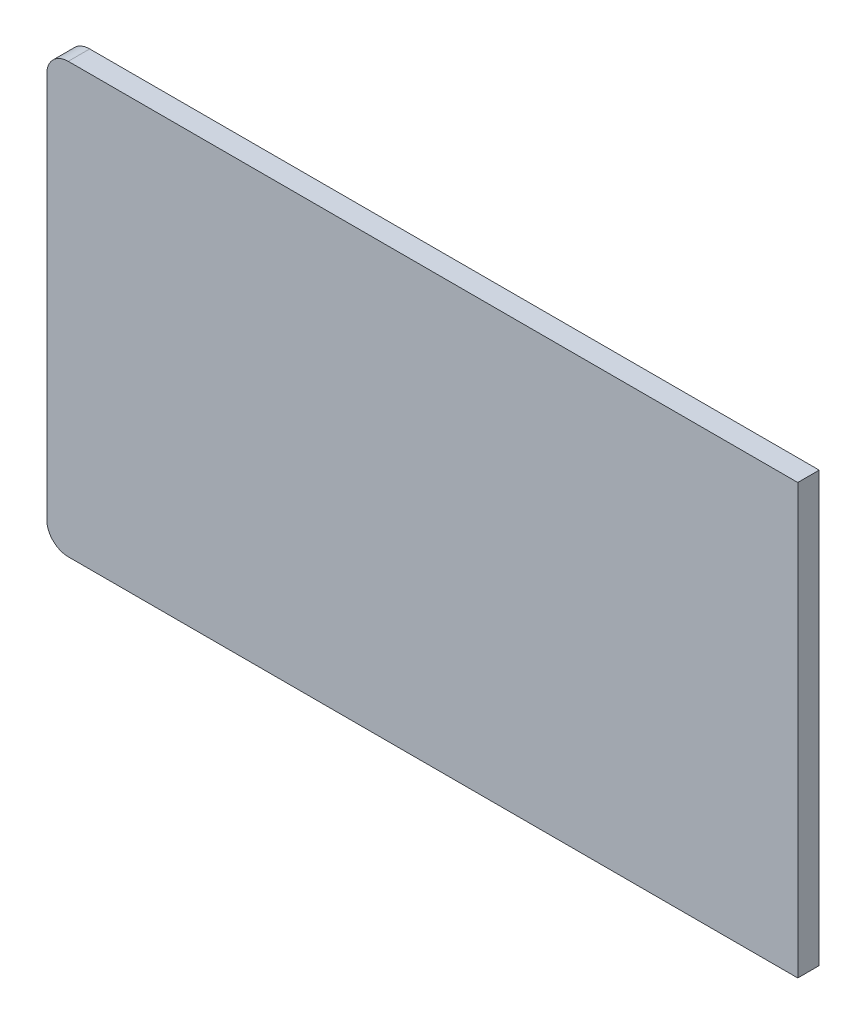
ISO-10303-21;
HEADER;
FILE_DESCRIPTION(('STEP AP214'),'2;1');
FILE_NAME('part.step','',(''),(''),'','','');
FILE_SCHEMA(('AUTOMOTIVE_DESIGN { 1 0 10303 214 1 1 1 1 }'));
ENDSEC;
DATA;
#1=APPLICATION_CONTEXT('core data for automotive mechanical design processes');
#2=APPLICATION_PROTOCOL_DEFINITION('international standard','automotive_design',2000,#1);
#3=PRODUCT_CONTEXT('',#1,'mechanical');
#4=PRODUCT('Part','Part','',(#3));
#5=PRODUCT_RELATED_PRODUCT_CATEGORY('part','',(#4));
#6=PRODUCT_DEFINITION_FORMATION('','',#4);
#7=PRODUCT_DEFINITION_CONTEXT('part definition',#1,'design');
#8=PRODUCT_DEFINITION('design','',#6,#7);
#9=PRODUCT_DEFINITION_SHAPE('','',#8);
#10=(LENGTH_UNIT() NAMED_UNIT(*) SI_UNIT(.MILLI.,.METRE.));
#11=(NAMED_UNIT(*) PLANE_ANGLE_UNIT() SI_UNIT($,.RADIAN.));
#12=(NAMED_UNIT(*) SI_UNIT($,.STERADIAN.) SOLID_ANGLE_UNIT());
#13=UNCERTAINTY_MEASURE_WITH_UNIT(LENGTH_MEASURE(1.E-05),#10,'distance_accuracy_value','');
#14=(GEOMETRIC_REPRESENTATION_CONTEXT(3) GLOBAL_UNCERTAINTY_ASSIGNED_CONTEXT((#13)) GLOBAL_UNIT_ASSIGNED_CONTEXT((#10,
#11,#12)) REPRESENTATION_CONTEXT('',''));
#15=CARTESIAN_POINT('',(0.,0.,0.));
#16=DIRECTION('',(0.,0.,1.));
#17=DIRECTION('',(1.,0.,0.));
#18=AXIS2_PLACEMENT_3D('',#15,#16,#17);
#19=CARTESIAN_POINT('',(35.,-20.,2.));
#20=DIRECTION('',(-1.,0.,0.));
#21=DIRECTION('',(0.,0.,1.));
#22=AXIS2_PLACEMENT_3D('',#19,#20,#21);
#23=PLANE('',#22);
#24=DIRECTION('',(0.,1.,0.));
#25=VECTOR('',#24,1.);
#26=CARTESIAN_POINT('',(35.,-20.,0.));
#27=LINE('',#26,#25);
#28=CARTESIAN_POINT('',(35.,-20.,0.));
#29=VERTEX_POINT('',#28);
#30=CARTESIAN_POINT('',(35.,20.,0.));
#31=VERTEX_POINT('',#30);
#32=EDGE_CURVE('E128',#29,#31,#27,.T.);
#33=ORIENTED_EDGE('',*,*,#32,.T.);
#34=DIRECTION('',(0.,0.,-1.));
#35=VECTOR('',#34,1.);
#36=CARTESIAN_POINT('',(35.,20.,2.));
#37=LINE('',#36,#35);
#38=CARTESIAN_POINT('',(35.,20.,2.));
#39=VERTEX_POINT('',#38);
#40=EDGE_CURVE('E11',#39,#31,#37,.T.);
#41=ORIENTED_EDGE('',*,*,#40,.F.);
#42=DIRECTION('',(0.,1.,0.));
#43=VECTOR('',#42,1.);
#44=CARTESIAN_POINT('',(35.,-20.,2.));
#45=LINE('',#44,#43);
#46=CARTESIAN_POINT('',(35.,-20.,2.));
#47=VERTEX_POINT('',#46);
#48=EDGE_CURVE('E144',#47,#39,#45,.T.);
#49=ORIENTED_EDGE('',*,*,#48,.F.);
#50=DIRECTION('',(0.,0.,-1.));
#51=VECTOR('',#50,1.);
#52=CARTESIAN_POINT('',(35.,-20.,2.));
#53=LINE('',#52,#51);
#54=EDGE_CURVE('E124',#47,#29,#53,.T.);
#55=ORIENTED_EDGE('',*,*,#54,.T.);
#56=EDGE_LOOP('',(#33,#41,#49,#55));
#57=FACE_BOUND('',#56,.T.);
#58=ADVANCED_FACE('F39',(#57),#23,.F.);
#59=CARTESIAN_POINT('',(35.,20.,2.));
#60=DIRECTION('',(0.,-1.,0.));
#61=DIRECTION('',(1.,0.,0.));
#62=AXIS2_PLACEMENT_3D('',#59,#60,#61);
#63=PLANE('',#62);
#64=DIRECTION('',(-1.,0.,0.));
#65=VECTOR('',#64,1.);
#66=CARTESIAN_POINT('',(35.,20.,0.));
#67=LINE('',#66,#65);
#68=CARTESIAN_POINT('',(-33.,20.,0.));
#69=VERTEX_POINT('',#68);
#70=EDGE_CURVE('E132',#31,#69,#67,.T.);
#71=ORIENTED_EDGE('',*,*,#70,.T.);
#72=DIRECTION('',(0.,0.,-1.));
#73=VECTOR('',#72,1.);
#74=CARTESIAN_POINT('',(-33.,20.,2.));
#75=LINE('',#74,#73);
#76=CARTESIAN_POINT('',(-33.,20.,2.));
#77=VERTEX_POINT('',#76);
#78=EDGE_CURVE('E48',#77,#69,#75,.T.);
#79=ORIENTED_EDGE('',*,*,#78,.F.);
#80=DIRECTION('',(-1.,0.,0.));
#81=VECTOR('',#80,1.);
#82=CARTESIAN_POINT('',(35.,20.,2.));
#83=LINE('',#82,#81);
#84=EDGE_CURVE('E93',#39,#77,#83,.T.);
#85=ORIENTED_EDGE('',*,*,#84,.F.);
#86=ORIENTED_EDGE('',*,*,#40,.T.);
#87=EDGE_LOOP('',(#71,#79,#85,#86));
#88=FACE_BOUND('',#87,.T.);
#89=ADVANCED_FACE('F172',(#88),#63,.F.);
#90=CARTESIAN_POINT('',(-33.,18.,2.));
#91=DIRECTION('',(0.,0.,-1.));
#92=DIRECTION('',(-1.,0.,0.));
#93=AXIS2_PLACEMENT_3D('',#90,#91,#92);
#94=CYLINDRICAL_SURFACE('',#93,2.);
#95=CARTESIAN_POINT('',(-33.,18.,0.));
#96=DIRECTION('',(0.,0.,1.));
#97=DIRECTION('',(1.,0.,0.));
#98=AXIS2_PLACEMENT_3D('',#95,#96,#97);
#99=CIRCLE('',#98,2.);
#100=CARTESIAN_POINT('',(-35.,18.,0.));
#101=VERTEX_POINT('',#100);
#102=EDGE_CURVE('E135',#69,#101,#99,.T.);
#103=ORIENTED_EDGE('',*,*,#102,.T.);
#104=DIRECTION('',(0.,0.,-1.));
#105=VECTOR('',#104,1.);
#106=CARTESIAN_POINT('',(-35.,18.,2.));
#107=LINE('',#106,#105);
#108=CARTESIAN_POINT('',(-35.,18.,2.));
#109=VERTEX_POINT('',#108);
#110=EDGE_CURVE('E117',#109,#101,#107,.T.);
#111=ORIENTED_EDGE('',*,*,#110,.F.);
#112=CARTESIAN_POINT('',(-33.,18.,2.));
#113=DIRECTION('',(0.,0.,1.));
#114=DIRECTION('',(1.,0.,0.));
#115=AXIS2_PLACEMENT_3D('',#112,#113,#114);
#116=CIRCLE('',#115,2.);
#117=EDGE_CURVE('E106',#77,#109,#116,.T.);
#118=ORIENTED_EDGE('',*,*,#117,.F.);
#119=ORIENTED_EDGE('',*,*,#78,.T.);
#120=EDGE_LOOP('',(#103,#111,#118,#119));
#121=FACE_BOUND('',#120,.T.);
#122=ADVANCED_FACE('F154',(#121),#94,.T.);
#123=CARTESIAN_POINT('',(-35.,-18.,2.));
#124=DIRECTION('',(1.,0.,0.));
#125=DIRECTION('',(0.,0.,-1.));
#126=AXIS2_PLACEMENT_3D('',#123,#124,#125);
#127=PLANE('',#126);
#128=DIRECTION('',(0.,-1.,0.));
#129=VECTOR('',#128,1.);
#130=CARTESIAN_POINT('',(-35.,-18.,0.));
#131=LINE('',#130,#129);
#132=CARTESIAN_POINT('',(-35.,-18.,0.));
#133=VERTEX_POINT('',#132);
#134=EDGE_CURVE('E115',#101,#133,#131,.T.);
#135=ORIENTED_EDGE('',*,*,#134,.T.);
#136=DIRECTION('',(0.,0.,-1.));
#137=VECTOR('',#136,1.);
#138=CARTESIAN_POINT('',(-35.,-18.,2.));
#139=LINE('',#138,#137);
#140=CARTESIAN_POINT('',(-35.,-18.,2.));
#141=VERTEX_POINT('',#140);
#142=EDGE_CURVE('E112',#141,#133,#139,.T.);
#143=ORIENTED_EDGE('',*,*,#142,.F.);
#144=DIRECTION('',(0.,-1.,0.));
#145=VECTOR('',#144,1.);
#146=CARTESIAN_POINT('',(-35.,-18.,2.));
#147=LINE('',#146,#145);
#148=EDGE_CURVE('E100',#109,#141,#147,.T.);
#149=ORIENTED_EDGE('',*,*,#148,.F.);
#150=ORIENTED_EDGE('',*,*,#110,.T.);
#151=EDGE_LOOP('',(#135,#143,#149,#150));
#152=FACE_BOUND('',#151,.T.);
#153=ADVANCED_FACE('F113',(#152),#127,.F.);
#154=CARTESIAN_POINT('',(-33.,-18.,2.));
#155=DIRECTION('',(0.,0.,-1.));
#156=DIRECTION('',(-1.,0.,0.));
#157=AXIS2_PLACEMENT_3D('',#154,#155,#156);
#158=CYLINDRICAL_SURFACE('',#157,2.);
#159=CARTESIAN_POINT('',(-33.,-18.,0.));
#160=DIRECTION('',(0.,0.,1.));
#161=DIRECTION('',(-1.,0.,0.));
#162=AXIS2_PLACEMENT_3D('',#159,#160,#161);
#163=CIRCLE('',#162,2.);
#164=CARTESIAN_POINT('',(-33.,-20.,0.));
#165=VERTEX_POINT('',#164);
#166=EDGE_CURVE('E79',#133,#165,#163,.T.);
#167=ORIENTED_EDGE('',*,*,#166,.T.);
#168=DIRECTION('',(0.,0.,-1.));
#169=VECTOR('',#168,1.);
#170=CARTESIAN_POINT('',(-33.,-20.,2.));
#171=LINE('',#170,#169);
#172=CARTESIAN_POINT('',(-33.,-20.,2.));
#173=VERTEX_POINT('',#172);
#174=EDGE_CURVE('E118',#173,#165,#171,.T.);
#175=ORIENTED_EDGE('',*,*,#174,.F.);
#176=CARTESIAN_POINT('',(-33.,-18.,2.));
#177=DIRECTION('',(0.,0.,1.));
#178=DIRECTION('',(-1.,0.,0.));
#179=AXIS2_PLACEMENT_3D('',#176,#177,#178);
#180=CIRCLE('',#179,2.);
#181=EDGE_CURVE('E104',#141,#173,#180,.T.);
#182=ORIENTED_EDGE('',*,*,#181,.F.);
#183=ORIENTED_EDGE('',*,*,#142,.T.);
#184=EDGE_LOOP('',(#167,#175,#182,#183));
#185=FACE_BOUND('',#184,.T.);
#186=ADVANCED_FACE('F120',(#185),#158,.T.);
#187=CARTESIAN_POINT('',(35.,-20.,2.));
#188=DIRECTION('',(0.,1.,0.));
#189=DIRECTION('',(-1.,0.,0.));
#190=AXIS2_PLACEMENT_3D('',#187,#188,#189);
#191=PLANE('',#190);
#192=DIRECTION('',(1.,0.,0.));
#193=VECTOR('',#192,1.);
#194=CARTESIAN_POINT('',(35.,-20.,0.));
#195=LINE('',#194,#193);
#196=EDGE_CURVE('E85',#165,#29,#195,.T.);
#197=ORIENTED_EDGE('',*,*,#196,.T.);
#198=ORIENTED_EDGE('',*,*,#54,.F.);
#199=DIRECTION('',(1.,0.,0.));
#200=VECTOR('',#199,1.);
#201=CARTESIAN_POINT('',(35.,-20.,2.));
#202=LINE('',#201,#200);
#203=EDGE_CURVE('E56',#173,#47,#202,.T.);
#204=ORIENTED_EDGE('',*,*,#203,.F.);
#205=ORIENTED_EDGE('',*,*,#174,.T.);
#206=EDGE_LOOP('',(#197,#198,#204,#205));
#207=FACE_BOUND('',#206,.T.);
#208=ADVANCED_FACE('F161',(#207),#191,.F.);
#209=CARTESIAN_POINT('',(-33.,18.,2.));
#210=DIRECTION('',(0.,0.,1.));
#211=DIRECTION('',(1.,0.,0.));
#212=AXIS2_PLACEMENT_3D('',#209,#210,#211);
#213=PLANE('',#212);
#214=ORIENTED_EDGE('',*,*,#48,.T.);
#215=ORIENTED_EDGE('',*,*,#84,.T.);
#216=ORIENTED_EDGE('',*,*,#117,.T.);
#217=ORIENTED_EDGE('',*,*,#148,.T.);
#218=ORIENTED_EDGE('',*,*,#181,.T.);
#219=ORIENTED_EDGE('',*,*,#203,.T.);
#220=EDGE_LOOP('',(#214,#215,#216,#217,#218,#219));
#221=FACE_BOUND('',#220,.T.);
#222=ADVANCED_FACE('F102',(#221),#213,.T.);
#223=CARTESIAN_POINT('',(-33.,18.,0.));
#224=DIRECTION('',(0.,0.,1.));
#225=DIRECTION('',(1.,0.,0.));
#226=AXIS2_PLACEMENT_3D('',#223,#224,#225);
#227=PLANE('',#226);
#228=ORIENTED_EDGE('',*,*,#32,.F.);
#229=ORIENTED_EDGE('',*,*,#196,.F.);
#230=ORIENTED_EDGE('',*,*,#166,.F.);
#231=ORIENTED_EDGE('',*,*,#134,.F.);
#232=ORIENTED_EDGE('',*,*,#102,.F.);
#233=ORIENTED_EDGE('',*,*,#70,.F.);
#234=EDGE_LOOP('',(#228,#229,#230,#231,#232,#233));
#235=FACE_BOUND('',#234,.T.);
#236=ADVANCED_FACE('F157',(#235),#227,.F.);
#237=CLOSED_SHELL('',(#58,#89,#122,#153,#186,#208,#222,#236));
#238=MANIFOLD_SOLID_BREP('B2',#237);
#239=ADVANCED_BREP_SHAPE_REPRESENTATION('',(#18,#238),#14);
#240=SHAPE_DEFINITION_REPRESENTATION(#9,#239);
ENDSEC;
END-ISO-10303-21;
